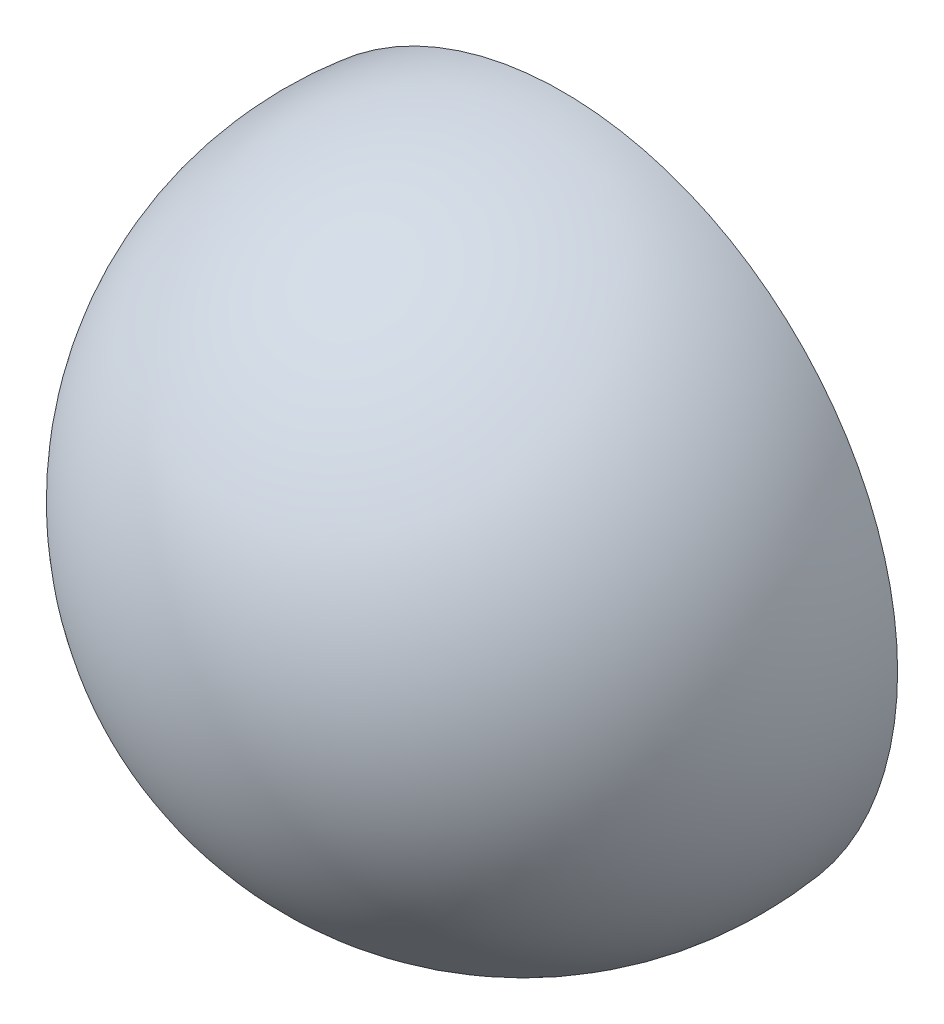
ISO-10303-21;
HEADER;
FILE_DESCRIPTION(('STEP AP214'),'2;1');
FILE_NAME('part.step','',(''),(''),'','','');
FILE_SCHEMA(('AUTOMOTIVE_DESIGN { 1 0 10303 214 1 1 1 1 }'));
ENDSEC;
DATA;
#1=APPLICATION_CONTEXT('core data for automotive mechanical design processes');
#2=APPLICATION_PROTOCOL_DEFINITION('international standard','automotive_design',2000,#1);
#3=PRODUCT_CONTEXT('',#1,'mechanical');
#4=PRODUCT('Part','Part','',(#3));
#5=PRODUCT_RELATED_PRODUCT_CATEGORY('part','',(#4));
#6=PRODUCT_DEFINITION_FORMATION('','',#4);
#7=PRODUCT_DEFINITION_CONTEXT('part definition',#1,'design');
#8=PRODUCT_DEFINITION('design','',#6,#7);
#9=PRODUCT_DEFINITION_SHAPE('','',#8);
#10=(LENGTH_UNIT() NAMED_UNIT(*) SI_UNIT(.MILLI.,.METRE.));
#11=(NAMED_UNIT(*) PLANE_ANGLE_UNIT() SI_UNIT($,.RADIAN.));
#12=(NAMED_UNIT(*) SI_UNIT($,.STERADIAN.) SOLID_ANGLE_UNIT());
#13=UNCERTAINTY_MEASURE_WITH_UNIT(LENGTH_MEASURE(1.E-05),#10,'distance_accuracy_value','');
#14=(GEOMETRIC_REPRESENTATION_CONTEXT(3) GLOBAL_UNCERTAINTY_ASSIGNED_CONTEXT((#13)) GLOBAL_UNIT_ASSIGNED_CONTEXT((#10,
#11,#12)) REPRESENTATION_CONTEXT('',''));
#15=CARTESIAN_POINT('',(0.,0.,0.));
#16=DIRECTION('',(0.,0.,1.));
#17=DIRECTION('',(1.,0.,0.));
#18=AXIS2_PLACEMENT_3D('',#15,#16,#17);
#19=CARTESIAN_POINT('',(0.,0.,0.));
#20=DIRECTION('',(0.,0.,-1.));
#21=DIRECTION('',(-1.,0.,0.));
#22=AXIS2_PLACEMENT_3D('',#19,#20,#21);
#23=PLANE('',#22);
#24=CARTESIAN_POINT('',(0.,0.,0.));
#25=DIRECTION('',(0.,0.,-1.));
#26=DIRECTION('',(-1.,0.,0.));
#27=AXIS2_PLACEMENT_3D('',#24,#25,#26);
#28=CIRCLE('',#27,4.);
#29=CARTESIAN_POINT('',(-4.,0.,0.));
#30=VERTEX_POINT('',#29);
#31=EDGE_CURVE('E10',#30,#30,#28,.T.);
#32=ORIENTED_EDGE('',*,*,#31,.T.);
#33=EDGE_LOOP('',(#32));
#34=FACE_BOUND('',#33,.T.);
#35=ADVANCED_FACE('F33',(#34),#23,.T.);
#36=CARTESIAN_POINT('',(0.,0.,0.472222222222222));
#37=DIRECTION('',(0.,0.,-1.));
#38=DIRECTION('',(-1.,0.,0.));
#39=AXIS2_PLACEMENT_3D('',#36,#37,#38);
#40=SPHERICAL_SURFACE('',#39,4.02777777777778);
#41=ORIENTED_EDGE('',*,*,#31,.F.);
#42=EDGE_LOOP('',(#41));
#43=FACE_BOUND('',#42,.T.);
#44=ADVANCED_FACE('F41',(#43),#40,.T.);
#45=CLOSED_SHELL('',(#35,#44));
#46=MANIFOLD_SOLID_BREP('B2',#45);
#47=ADVANCED_BREP_SHAPE_REPRESENTATION('',(#18,#46),#14);
#48=SHAPE_DEFINITION_REPRESENTATION(#9,#47);
ENDSEC;
END-ISO-10303-21;
